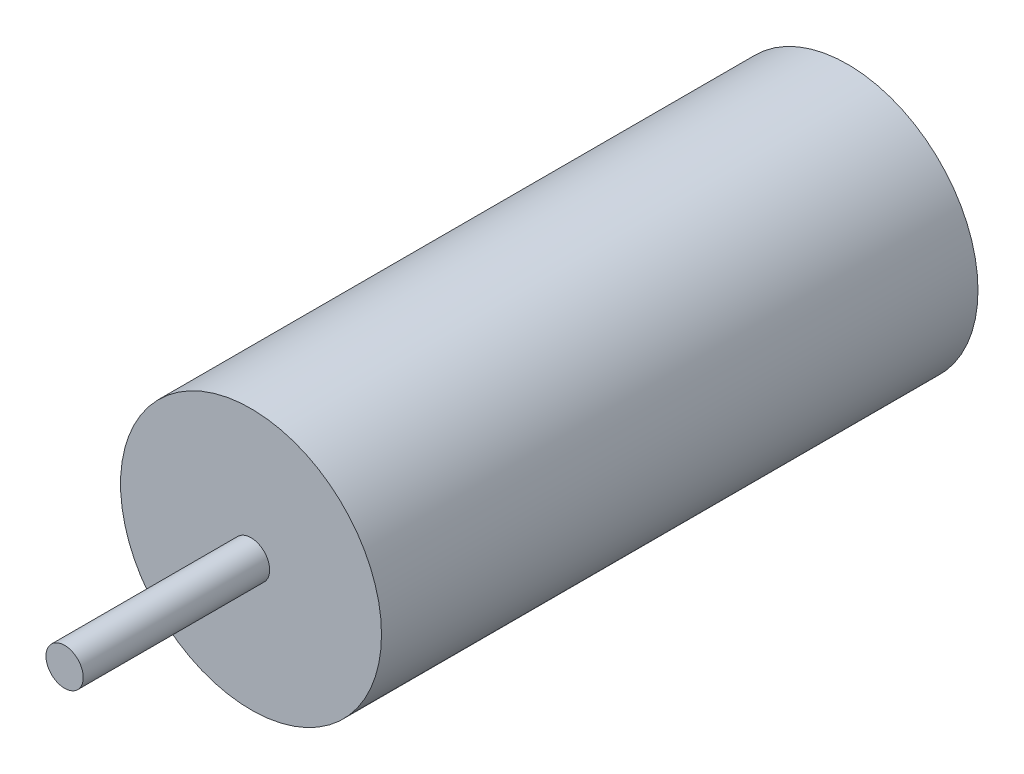
ISO-10303-21;
HEADER;
FILE_DESCRIPTION(('STEP AP214'),'2;1');
FILE_NAME('part.step','',(''),(''),'','','');
FILE_SCHEMA(('AUTOMOTIVE_DESIGN { 1 0 10303 214 1 1 1 1 }'));
ENDSEC;
DATA;
#1=APPLICATION_CONTEXT('core data for automotive mechanical design processes');
#2=APPLICATION_PROTOCOL_DEFINITION('international standard','automotive_design',2000,#1);
#3=PRODUCT_CONTEXT('',#1,'mechanical');
#4=PRODUCT('Part','Part','',(#3));
#5=PRODUCT_RELATED_PRODUCT_CATEGORY('part','',(#4));
#6=PRODUCT_DEFINITION_FORMATION('','',#4);
#7=PRODUCT_DEFINITION_CONTEXT('part definition',#1,'design');
#8=PRODUCT_DEFINITION('design','',#6,#7);
#9=PRODUCT_DEFINITION_SHAPE('','',#8);
#10=(LENGTH_UNIT() NAMED_UNIT(*) SI_UNIT(.MILLI.,.METRE.));
#11=(NAMED_UNIT(*) PLANE_ANGLE_UNIT() SI_UNIT($,.RADIAN.));
#12=(NAMED_UNIT(*) SI_UNIT($,.STERADIAN.) SOLID_ANGLE_UNIT());
#13=UNCERTAINTY_MEASURE_WITH_UNIT(LENGTH_MEASURE(1.E-05),#10,'distance_accuracy_value','');
#14=(GEOMETRIC_REPRESENTATION_CONTEXT(3) GLOBAL_UNCERTAINTY_ASSIGNED_CONTEXT((#13)) GLOBAL_UNIT_ASSIGNED_CONTEXT((#10,
#11,#12)) REPRESENTATION_CONTEXT('',''));
#15=CARTESIAN_POINT('',(0.,0.,0.));
#16=DIRECTION('',(0.,0.,1.));
#17=DIRECTION('',(1.,0.,0.));
#18=AXIS2_PLACEMENT_3D('',#15,#16,#17);
#19=CARTESIAN_POINT('',(0.,0.,16.));
#20=DIRECTION('',(0.,0.,-1.));
#21=DIRECTION('',(-1.,0.,0.));
#22=AXIS2_PLACEMENT_3D('',#19,#20,#21);
#23=CYLINDRICAL_SURFACE('',#22,3.5);
#24=CARTESIAN_POINT('',(0.,0.,16.));
#25=DIRECTION('',(0.,0.,1.));
#26=DIRECTION('',(1.,0.,0.));
#27=AXIS2_PLACEMENT_3D('',#24,#25,#26);
#28=CIRCLE('',#27,3.5);
#29=CARTESIAN_POINT('',(3.5,0.,16.));
#30=VERTEX_POINT('',#29);
#31=EDGE_CURVE('E10',#30,#30,#28,.T.);
#32=ORIENTED_EDGE('',*,*,#31,.F.);
#33=EDGE_LOOP('',(#32));
#34=FACE_BOUND('',#33,.T.);
#35=CARTESIAN_POINT('',(0.,0.,0.));
#36=DIRECTION('',(0.,0.,1.));
#37=DIRECTION('',(1.,0.,0.));
#38=AXIS2_PLACEMENT_3D('',#35,#36,#37);
#39=CIRCLE('',#38,3.5);
#40=CARTESIAN_POINT('',(3.5,0.,0.));
#41=VERTEX_POINT('',#40);
#42=EDGE_CURVE('E34',#41,#41,#39,.T.);
#43=ORIENTED_EDGE('',*,*,#42,.T.);
#44=EDGE_LOOP('',(#43));
#45=FACE_BOUND('',#44,.T.);
#46=ADVANCED_FACE('F31',(#34,#45),#23,.T.);
#47=CARTESIAN_POINT('',(0.,0.,16.));
#48=DIRECTION('',(0.,0.,1.));
#49=DIRECTION('',(1.,0.,0.));
#50=AXIS2_PLACEMENT_3D('',#47,#48,#49);
#51=PLANE('',#50);
#52=CARTESIAN_POINT('',(0.,0.,16.));
#53=DIRECTION('',(0.,0.,1.));
#54=DIRECTION('',(1.,0.,0.));
#55=AXIS2_PLACEMENT_3D('',#52,#53,#54);
#56=CIRCLE('',#55,0.5);
#57=CARTESIAN_POINT('',(0.5,0.,16.));
#58=VERTEX_POINT('',#57);
#59=EDGE_CURVE('E43',#58,#58,#56,.T.);
#60=ORIENTED_EDGE('',*,*,#59,.F.);
#61=EDGE_LOOP('',(#60));
#62=FACE_BOUND('',#61,.T.);
#63=ORIENTED_EDGE('',*,*,#31,.T.);
#64=EDGE_LOOP('',(#63));
#65=FACE_BOUND('',#64,.T.);
#66=ADVANCED_FACE('F58',(#62,#65),#51,.T.);
#67=CARTESIAN_POINT('',(0.,0.,0.));
#68=DIRECTION('',(0.,0.,1.));
#69=DIRECTION('',(1.,0.,0.));
#70=AXIS2_PLACEMENT_3D('',#67,#68,#69);
#71=PLANE('',#70);
#72=ORIENTED_EDGE('',*,*,#42,.F.);
#73=EDGE_LOOP('',(#72));
#74=FACE_BOUND('',#73,.T.);
#75=ADVANCED_FACE('F54',(#74),#71,.F.);
#76=CARTESIAN_POINT('',(0.,0.,21.));
#77=DIRECTION('',(0.,0.,-1.));
#78=DIRECTION('',(-1.,0.,0.));
#79=AXIS2_PLACEMENT_3D('',#76,#77,#78);
#80=CYLINDRICAL_SURFACE('',#79,0.5);
#81=CARTESIAN_POINT('',(0.,0.,21.));
#82=DIRECTION('',(0.,0.,1.));
#83=DIRECTION('',(1.,0.,0.));
#84=AXIS2_PLACEMENT_3D('',#81,#82,#83);
#85=CIRCLE('',#84,0.5);
#86=CARTESIAN_POINT('',(0.5,0.,21.));
#87=VERTEX_POINT('',#86);
#88=EDGE_CURVE('E41',#87,#87,#85,.T.);
#89=ORIENTED_EDGE('',*,*,#88,.F.);
#90=EDGE_LOOP('',(#89));
#91=FACE_BOUND('',#90,.T.);
#92=ORIENTED_EDGE('',*,*,#59,.T.);
#93=EDGE_LOOP('',(#92));
#94=FACE_BOUND('',#93,.T.);
#95=ADVANCED_FACE('F51',(#91,#94),#80,.T.);
#96=CARTESIAN_POINT('',(0.,0.,21.));
#97=DIRECTION('',(0.,0.,1.));
#98=DIRECTION('',(1.,0.,0.));
#99=AXIS2_PLACEMENT_3D('',#96,#97,#98);
#100=PLANE('',#99);
#101=ORIENTED_EDGE('',*,*,#88,.T.);
#102=EDGE_LOOP('',(#101));
#103=FACE_BOUND('',#102,.T.);
#104=ADVANCED_FACE('F49',(#103),#100,.T.);
#105=CLOSED_SHELL('',(#46,#66,#75,#95,#104));
#106=MANIFOLD_SOLID_BREP('B2',#105);
#107=ADVANCED_BREP_SHAPE_REPRESENTATION('',(#18,#106),#14);
#108=SHAPE_DEFINITION_REPRESENTATION(#9,#107);
ENDSEC;
END-ISO-10303-21;
